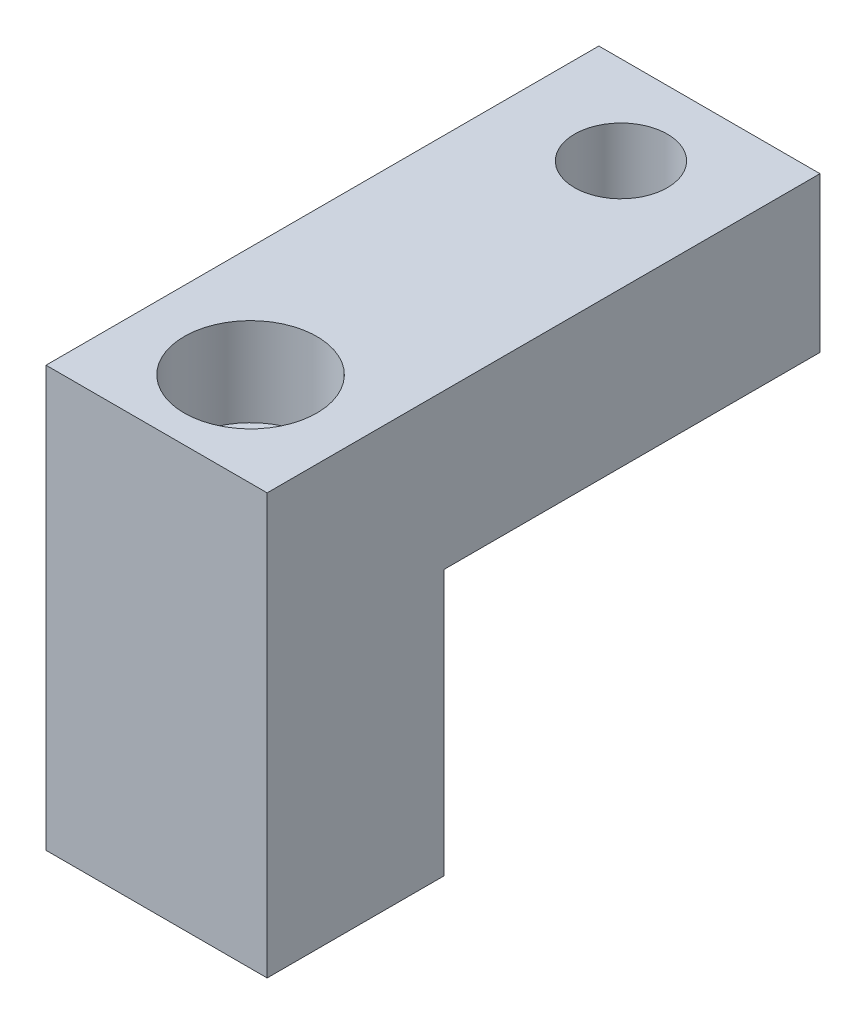
ISO-10303-21;
HEADER;
FILE_DESCRIPTION(('STEP AP214'),'2;1');
FILE_NAME('part.step','',(''),(''),'','','');
FILE_SCHEMA(('AUTOMOTIVE_DESIGN { 1 0 10303 214 1 1 1 1 }'));
ENDSEC;
DATA;
#1=APPLICATION_CONTEXT('core data for automotive mechanical design processes');
#2=APPLICATION_PROTOCOL_DEFINITION('international standard','automotive_design',2000,#1);
#3=PRODUCT_CONTEXT('',#1,'mechanical');
#4=PRODUCT('Part','Part','',(#3));
#5=PRODUCT_RELATED_PRODUCT_CATEGORY('part','',(#4));
#6=PRODUCT_DEFINITION_FORMATION('','',#4);
#7=PRODUCT_DEFINITION_CONTEXT('part definition',#1,'design');
#8=PRODUCT_DEFINITION('design','',#6,#7);
#9=PRODUCT_DEFINITION_SHAPE('','',#8);
#10=(LENGTH_UNIT() NAMED_UNIT(*) SI_UNIT(.MILLI.,.METRE.));
#11=(NAMED_UNIT(*) PLANE_ANGLE_UNIT() SI_UNIT($,.RADIAN.));
#12=(NAMED_UNIT(*) SI_UNIT($,.STERADIAN.) SOLID_ANGLE_UNIT());
#13=UNCERTAINTY_MEASURE_WITH_UNIT(LENGTH_MEASURE(1.E-05),#10,'distance_accuracy_value','');
#14=(GEOMETRIC_REPRESENTATION_CONTEXT(3) GLOBAL_UNCERTAINTY_ASSIGNED_CONTEXT((#13)) GLOBAL_UNIT_ASSIGNED_CONTEXT((#10,
#11,#12)) REPRESENTATION_CONTEXT('',''));
#15=CARTESIAN_POINT('',(0.,0.,0.));
#16=DIRECTION('',(0.,0.,1.));
#17=DIRECTION('',(1.,0.,0.));
#18=AXIS2_PLACEMENT_3D('',#15,#16,#17);
#19=CARTESIAN_POINT('',(5.,-12.,-4.25));
#20=DIRECTION('',(0.,1.,0.));
#21=DIRECTION('',(0.,0.,1.));
#22=AXIS2_PLACEMENT_3D('',#19,#20,#21);
#23=CYLINDRICAL_SURFACE('',#22,1.7);
#24=CARTESIAN_POINT('',(5.,-12.,-4.25));
#25=DIRECTION('',(0.,1.,0.));
#26=DIRECTION('',(0.,0.,1.));
#27=AXIS2_PLACEMENT_3D('',#24,#25,#26);
#28=CIRCLE('',#27,1.7);
#29=CARTESIAN_POINT('',(5.,-12.,-2.55));
#30=VERTEX_POINT('',#29);
#31=EDGE_CURVE('E153',#30,#30,#28,.T.);
#32=ORIENTED_EDGE('',*,*,#31,.F.);
#33=EDGE_LOOP('',(#32));
#34=FACE_BOUND('',#33,.T.);
#35=CARTESIAN_POINT('',(5.,3.,-4.25));
#36=DIRECTION('',(0.,1.,0.));
#37=DIRECTION('',(0.,0.,1.));
#38=AXIS2_PLACEMENT_3D('',#35,#36,#37);
#39=CIRCLE('',#38,1.7);
#40=CARTESIAN_POINT('',(5.,3.,-2.55));
#41=VERTEX_POINT('',#40);
#42=EDGE_CURVE('E41',#41,#41,#39,.F.);
#43=ORIENTED_EDGE('',*,*,#42,.F.);
#44=EDGE_LOOP('',(#43));
#45=FACE_BOUND('',#44,.T.);
#46=ADVANCED_FACE('F37',(#34,#45),#23,.F.);
#47=CARTESIAN_POINT('',(0.,7.,0.));
#48=DIRECTION('',(0.,-1.,0.));
#49=DIRECTION('',(0.,0.,-1.));
#50=AXIS2_PLACEMENT_3D('',#47,#48,#49);
#51=PLANE('',#50);
#52=CARTESIAN_POINT('',(5.,7.,-4.25));
#53=DIRECTION('',(0.,1.,0.));
#54=DIRECTION('',(0.,0.,1.));
#55=AXIS2_PLACEMENT_3D('',#52,#53,#54);
#56=CIRCLE('',#55,3.);
#57=CARTESIAN_POINT('',(5.,7.,-1.25));
#58=VERTEX_POINT('',#57);
#59=EDGE_CURVE('E161',#58,#58,#56,.T.);
#60=ORIENTED_EDGE('',*,*,#59,.F.);
#61=EDGE_LOOP('',(#60));
#62=FACE_BOUND('',#61,.T.);
#63=DIRECTION('',(0.,0.,1.));
#64=VECTOR('',#63,1.);
#65=CARTESIAN_POINT('',(0.,7.,0.));
#66=LINE('',#65,#64);
#67=CARTESIAN_POINT('',(0.,7.,-25.));
#68=VERTEX_POINT('',#67);
#69=CARTESIAN_POINT('',(0.,7.,0.));
#70=VERTEX_POINT('',#69);
#71=EDGE_CURVE('E132',#68,#70,#66,.T.);
#72=ORIENTED_EDGE('',*,*,#71,.T.);
#73=DIRECTION('',(1.,0.,0.));
#74=VECTOR('',#73,1.);
#75=CARTESIAN_POINT('',(0.,7.,0.));
#76=LINE('',#75,#74);
#77=CARTESIAN_POINT('',(10.,7.,0.));
#78=VERTEX_POINT('',#77);
#79=EDGE_CURVE('E84',#70,#78,#76,.T.);
#80=ORIENTED_EDGE('',*,*,#79,.T.);
#81=DIRECTION('',(0.,0.,-1.));
#82=VECTOR('',#81,1.);
#83=CARTESIAN_POINT('',(10.,7.,0.));
#84=LINE('',#83,#82);
#85=CARTESIAN_POINT('',(10.,7.,-25.));
#86=VERTEX_POINT('',#85);
#87=EDGE_CURVE('E135',#78,#86,#84,.T.);
#88=ORIENTED_EDGE('',*,*,#87,.T.);
#89=DIRECTION('',(-1.,0.,0.));
#90=VECTOR('',#89,1.);
#91=CARTESIAN_POINT('',(0.,7.,-25.));
#92=LINE('',#91,#90);
#93=EDGE_CURVE('E62',#86,#68,#92,.T.);
#94=ORIENTED_EDGE('',*,*,#93,.T.);
#95=EDGE_LOOP('',(#72,#80,#88,#94));
#96=FACE_BOUND('',#95,.T.);
#97=CARTESIAN_POINT('',(5.,7.,-21.));
#98=DIRECTION('',(0.,1.,0.));
#99=DIRECTION('',(0.,0.,1.));
#100=AXIS2_PLACEMENT_3D('',#97,#98,#99);
#101=CIRCLE('',#100,2.1);
#102=CARTESIAN_POINT('',(5.,7.,-18.9));
#103=VERTEX_POINT('',#102);
#104=EDGE_CURVE('E125',#103,#103,#101,.T.);
#105=ORIENTED_EDGE('',*,*,#104,.F.);
#106=EDGE_LOOP('',(#105));
#107=FACE_BOUND('',#106,.T.);
#108=ADVANCED_FACE('F176',(#62,#96,#107),#51,.F.);
#109=CARTESIAN_POINT('',(0.,0.,0.));
#110=DIRECTION('',(0.,-1.,0.));
#111=DIRECTION('',(0.,0.,-1.));
#112=AXIS2_PLACEMENT_3D('',#109,#110,#111);
#113=PLANE('',#112);
#114=DIRECTION('',(1.,0.,0.));
#115=VECTOR('',#114,1.);
#116=CARTESIAN_POINT('',(0.,0.,-8.));
#117=LINE('',#116,#115);
#118=CARTESIAN_POINT('',(0.,0.,-8.));
#119=VERTEX_POINT('',#118);
#120=CARTESIAN_POINT('',(10.,0.,-8.));
#121=VERTEX_POINT('',#120);
#122=EDGE_CURVE('E53',#119,#121,#117,.T.);
#123=ORIENTED_EDGE('',*,*,#122,.F.);
#124=DIRECTION('',(0.,0.,1.));
#125=VECTOR('',#124,1.);
#126=CARTESIAN_POINT('',(0.,0.,0.));
#127=LINE('',#126,#125);
#128=CARTESIAN_POINT('',(0.,0.,-25.));
#129=VERTEX_POINT('',#128);
#130=EDGE_CURVE('E121',#129,#119,#127,.T.);
#131=ORIENTED_EDGE('',*,*,#130,.F.);
#132=DIRECTION('',(-1.,0.,0.));
#133=VECTOR('',#132,1.);
#134=CARTESIAN_POINT('',(0.,0.,-25.));
#135=LINE('',#134,#133);
#136=CARTESIAN_POINT('',(10.,0.,-25.));
#137=VERTEX_POINT('',#136);
#138=EDGE_CURVE('E77',#137,#129,#135,.T.);
#139=ORIENTED_EDGE('',*,*,#138,.F.);
#140=DIRECTION('',(0.,0.,-1.));
#141=VECTOR('',#140,1.);
#142=CARTESIAN_POINT('',(10.,0.,0.));
#143=LINE('',#142,#141);
#144=EDGE_CURVE('E140',#121,#137,#143,.T.);
#145=ORIENTED_EDGE('',*,*,#144,.F.);
#146=EDGE_LOOP('',(#123,#131,#139,#145));
#147=FACE_BOUND('',#146,.T.);
#148=CARTESIAN_POINT('',(5.,0.,-21.));
#149=DIRECTION('',(0.,1.,0.));
#150=DIRECTION('',(0.,0.,1.));
#151=AXIS2_PLACEMENT_3D('',#148,#149,#150);
#152=CIRCLE('',#151,2.1);
#153=CARTESIAN_POINT('',(5.,0.,-18.9));
#154=VERTEX_POINT('',#153);
#155=EDGE_CURVE('E122',#154,#154,#152,.T.);
#156=ORIENTED_EDGE('',*,*,#155,.T.);
#157=EDGE_LOOP('',(#156));
#158=FACE_BOUND('',#157,.T.);
#159=ADVANCED_FACE('F178',(#147,#158),#113,.T.);
#160=CARTESIAN_POINT('',(0.,7.,0.));
#161=DIRECTION('',(1.,0.,0.));
#162=DIRECTION('',(0.,0.,-1.));
#163=AXIS2_PLACEMENT_3D('',#160,#161,#162);
#164=PLANE('',#163);
#165=ORIENTED_EDGE('',*,*,#130,.T.);
#166=DIRECTION('',(0.,1.,0.));
#167=VECTOR('',#166,1.);
#168=CARTESIAN_POINT('',(0.,-12.,-8.));
#169=LINE('',#168,#167);
#170=CARTESIAN_POINT('',(0.,-12.,-8.));
#171=VERTEX_POINT('',#170);
#172=EDGE_CURVE('E104',#171,#119,#169,.T.);
#173=ORIENTED_EDGE('',*,*,#172,.F.);
#174=DIRECTION('',(0.,0.,-1.));
#175=VECTOR('',#174,1.);
#176=CARTESIAN_POINT('',(0.,-12.,0.));
#177=LINE('',#176,#175);
#178=CARTESIAN_POINT('',(0.,-12.,0.));
#179=VERTEX_POINT('',#178);
#180=EDGE_CURVE('E111',#179,#171,#177,.T.);
#181=ORIENTED_EDGE('',*,*,#180,.F.);
#182=DIRECTION('',(0.,-1.,0.));
#183=VECTOR('',#182,1.);
#184=CARTESIAN_POINT('',(0.,7.,0.));
#185=LINE('',#184,#183);
#186=EDGE_CURVE('E11',#70,#179,#185,.T.);
#187=ORIENTED_EDGE('',*,*,#186,.F.);
#188=ORIENTED_EDGE('',*,*,#71,.F.);
#189=DIRECTION('',(0.,-1.,0.));
#190=VECTOR('',#189,1.);
#191=CARTESIAN_POINT('',(0.,7.,-25.));
#192=LINE('',#191,#190);
#193=EDGE_CURVE('E138',#68,#129,#192,.T.);
#194=ORIENTED_EDGE('',*,*,#193,.T.);
#195=EDGE_LOOP('',(#165,#173,#181,#187,#188,#194));
#196=FACE_BOUND('',#195,.T.);
#197=ADVANCED_FACE('F39',(#196),#164,.F.);
#198=CARTESIAN_POINT('',(0.,7.,0.));
#199=DIRECTION('',(0.,0.,-1.));
#200=DIRECTION('',(-1.,0.,0.));
#201=AXIS2_PLACEMENT_3D('',#198,#199,#200);
#202=PLANE('',#201);
#203=ORIENTED_EDGE('',*,*,#186,.T.);
#204=DIRECTION('',(-1.,0.,0.));
#205=VECTOR('',#204,1.);
#206=CARTESIAN_POINT('',(0.,-12.,0.));
#207=LINE('',#206,#205);
#208=CARTESIAN_POINT('',(10.,-12.,0.));
#209=VERTEX_POINT('',#208);
#210=EDGE_CURVE('E117',#209,#179,#207,.T.);
#211=ORIENTED_EDGE('',*,*,#210,.F.);
#212=DIRECTION('',(0.,-1.,0.));
#213=VECTOR('',#212,1.);
#214=CARTESIAN_POINT('',(10.,7.,0.));
#215=LINE('',#214,#213);
#216=EDGE_CURVE('E46',#78,#209,#215,.T.);
#217=ORIENTED_EDGE('',*,*,#216,.F.);
#218=ORIENTED_EDGE('',*,*,#79,.F.);
#219=EDGE_LOOP('',(#203,#211,#217,#218));
#220=FACE_BOUND('',#219,.T.);
#221=ADVANCED_FACE('F151',(#220),#202,.F.);
#222=CARTESIAN_POINT('',(10.,7.,0.));
#223=DIRECTION('',(-1.,0.,0.));
#224=DIRECTION('',(0.,0.,1.));
#225=AXIS2_PLACEMENT_3D('',#222,#223,#224);
#226=PLANE('',#225);
#227=ORIENTED_EDGE('',*,*,#216,.T.);
#228=DIRECTION('',(0.,0.,1.));
#229=VECTOR('',#228,1.);
#230=CARTESIAN_POINT('',(10.,-12.,0.));
#231=LINE('',#230,#229);
#232=CARTESIAN_POINT('',(10.,-12.,-8.));
#233=VERTEX_POINT('',#232);
#234=EDGE_CURVE('E110',#233,#209,#231,.T.);
#235=ORIENTED_EDGE('',*,*,#234,.F.);
#236=DIRECTION('',(0.,1.,0.));
#237=VECTOR('',#236,1.);
#238=CARTESIAN_POINT('',(10.,-12.,-8.));
#239=LINE('',#238,#237);
#240=EDGE_CURVE('E106',#233,#121,#239,.T.);
#241=ORIENTED_EDGE('',*,*,#240,.T.);
#242=ORIENTED_EDGE('',*,*,#144,.T.);
#243=DIRECTION('',(0.,-1.,0.));
#244=VECTOR('',#243,1.);
#245=CARTESIAN_POINT('',(10.,7.,-25.));
#246=LINE('',#245,#244);
#247=EDGE_CURVE('E144',#86,#137,#246,.T.);
#248=ORIENTED_EDGE('',*,*,#247,.F.);
#249=ORIENTED_EDGE('',*,*,#87,.F.);
#250=EDGE_LOOP('',(#227,#235,#241,#242,#248,#249));
#251=FACE_BOUND('',#250,.T.);
#252=ADVANCED_FACE('F148',(#251),#226,.F.);
#253=CARTESIAN_POINT('',(0.,7.,-25.));
#254=DIRECTION('',(0.,0.,1.));
#255=DIRECTION('',(1.,0.,0.));
#256=AXIS2_PLACEMENT_3D('',#253,#254,#255);
#257=PLANE('',#256);
#258=ORIENTED_EDGE('',*,*,#138,.T.);
#259=ORIENTED_EDGE('',*,*,#193,.F.);
#260=ORIENTED_EDGE('',*,*,#93,.F.);
#261=ORIENTED_EDGE('',*,*,#247,.T.);
#262=EDGE_LOOP('',(#258,#259,#260,#261));
#263=FACE_BOUND('',#262,.T.);
#264=ADVANCED_FACE('F187',(#263),#257,.F.);
#265=CARTESIAN_POINT('',(5.,7.,-21.));
#266=DIRECTION('',(0.,-1.,0.));
#267=DIRECTION('',(0.,0.,-1.));
#268=AXIS2_PLACEMENT_3D('',#265,#266,#267);
#269=CYLINDRICAL_SURFACE('',#268,2.1);
#270=ORIENTED_EDGE('',*,*,#104,.T.);
#271=EDGE_LOOP('',(#270));
#272=FACE_BOUND('',#271,.T.);
#273=ORIENTED_EDGE('',*,*,#155,.F.);
#274=EDGE_LOOP('',(#273));
#275=FACE_BOUND('',#274,.T.);
#276=ADVANCED_FACE('F184',(#272,#275),#269,.F.);
#277=CARTESIAN_POINT('',(0.,-12.,-8.));
#278=DIRECTION('',(0.,0.,1.));
#279=DIRECTION('',(1.,0.,0.));
#280=AXIS2_PLACEMENT_3D('',#277,#278,#279);
#281=PLANE('',#280);
#282=ORIENTED_EDGE('',*,*,#122,.T.);
#283=ORIENTED_EDGE('',*,*,#240,.F.);
#284=DIRECTION('',(1.,0.,0.));
#285=VECTOR('',#284,1.);
#286=CARTESIAN_POINT('',(0.,-12.,-8.));
#287=LINE('',#286,#285);
#288=EDGE_CURVE('E100',#171,#233,#287,.T.);
#289=ORIENTED_EDGE('',*,*,#288,.F.);
#290=ORIENTED_EDGE('',*,*,#172,.T.);
#291=EDGE_LOOP('',(#282,#283,#289,#290));
#292=FACE_BOUND('',#291,.T.);
#293=ADVANCED_FACE('F102',(#292),#281,.F.);
#294=CARTESIAN_POINT('',(0.,-12.,0.));
#295=DIRECTION('',(0.,-1.,0.));
#296=DIRECTION('',(0.,0.,-1.));
#297=AXIS2_PLACEMENT_3D('',#294,#295,#296);
#298=PLANE('',#297);
#299=ORIENTED_EDGE('',*,*,#31,.T.);
#300=EDGE_LOOP('',(#299));
#301=FACE_BOUND('',#300,.T.);
#302=ORIENTED_EDGE('',*,*,#180,.T.);
#303=ORIENTED_EDGE('',*,*,#288,.T.);
#304=ORIENTED_EDGE('',*,*,#234,.T.);
#305=ORIENTED_EDGE('',*,*,#210,.T.);
#306=EDGE_LOOP('',(#302,#303,#304,#305));
#307=FACE_BOUND('',#306,.T.);
#308=ADVANCED_FACE('F115',(#301,#307),#298,.T.);
#309=CARTESIAN_POINT('',(5.,3.,-4.25));
#310=DIRECTION('',(0.,1.,0.));
#311=DIRECTION('',(0.,0.,1.));
#312=AXIS2_PLACEMENT_3D('',#309,#310,#311);
#313=PLANE('',#312);
#314=CARTESIAN_POINT('',(5.,3.,-4.25));
#315=DIRECTION('',(0.,1.,0.));
#316=DIRECTION('',(0.,0.,1.));
#317=AXIS2_PLACEMENT_3D('',#314,#315,#316);
#318=CIRCLE('',#317,3.);
#319=CARTESIAN_POINT('',(5.,3.,-1.25));
#320=VERTEX_POINT('',#319);
#321=EDGE_CURVE('E159',#320,#320,#318,.T.);
#322=ORIENTED_EDGE('',*,*,#321,.T.);
#323=EDGE_LOOP('',(#322));
#324=FACE_BOUND('',#323,.T.);
#325=ORIENTED_EDGE('',*,*,#42,.T.);
#326=EDGE_LOOP('',(#325));
#327=FACE_BOUND('',#326,.T.);
#328=ADVANCED_FACE('F167',(#324,#327),#313,.T.);
#329=CARTESIAN_POINT('',(5.,3.,-4.25));
#330=DIRECTION('',(0.,1.,0.));
#331=DIRECTION('',(0.,0.,1.));
#332=AXIS2_PLACEMENT_3D('',#329,#330,#331);
#333=CYLINDRICAL_SURFACE('',#332,3.);
#334=ORIENTED_EDGE('',*,*,#321,.F.);
#335=EDGE_LOOP('',(#334));
#336=FACE_BOUND('',#335,.T.);
#337=ORIENTED_EDGE('',*,*,#59,.T.);
#338=EDGE_LOOP('',(#337));
#339=FACE_BOUND('',#338,.T.);
#340=ADVANCED_FACE('F170',(#336,#339),#333,.F.);
#341=CLOSED_SHELL('',(#46,#108,#159,#197,#221,#252,#264,#276,#293,#308,#328,#340));
#342=MANIFOLD_SOLID_BREP('B2',#341);
#343=ADVANCED_BREP_SHAPE_REPRESENTATION('',(#18,#342),#14);
#344=SHAPE_DEFINITION_REPRESENTATION(#9,#343);
ENDSEC;
END-ISO-10303-21;
